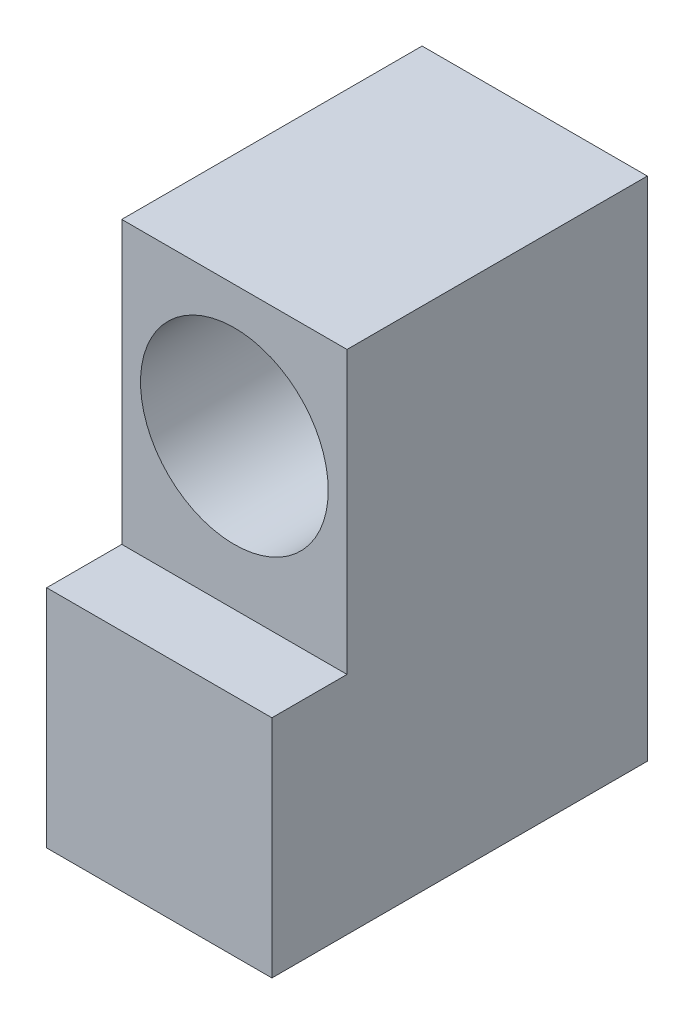
ISO-10303-21;
HEADER;
FILE_DESCRIPTION(('STEP AP214'),'2;1');
FILE_NAME('part.step','',(''),(''),'','','');
FILE_SCHEMA(('AUTOMOTIVE_DESIGN { 1 0 10303 214 1 1 1 1 }'));
ENDSEC;
DATA;
#1=APPLICATION_CONTEXT('core data for automotive mechanical design processes');
#2=APPLICATION_PROTOCOL_DEFINITION('international standard','automotive_design',2000,#1);
#3=PRODUCT_CONTEXT('',#1,'mechanical');
#4=PRODUCT('Part','Part','',(#3));
#5=PRODUCT_RELATED_PRODUCT_CATEGORY('part','',(#4));
#6=PRODUCT_DEFINITION_FORMATION('','',#4);
#7=PRODUCT_DEFINITION_CONTEXT('part definition',#1,'design');
#8=PRODUCT_DEFINITION('design','',#6,#7);
#9=PRODUCT_DEFINITION_SHAPE('','',#8);
#10=(LENGTH_UNIT() NAMED_UNIT(*) SI_UNIT(.MILLI.,.METRE.));
#11=(NAMED_UNIT(*) PLANE_ANGLE_UNIT() SI_UNIT($,.RADIAN.));
#12=(NAMED_UNIT(*) SI_UNIT($,.STERADIAN.) SOLID_ANGLE_UNIT());
#13=UNCERTAINTY_MEASURE_WITH_UNIT(LENGTH_MEASURE(1.E-05),#10,'distance_accuracy_value','');
#14=(GEOMETRIC_REPRESENTATION_CONTEXT(3) GLOBAL_UNCERTAINTY_ASSIGNED_CONTEXT((#13)) GLOBAL_UNIT_ASSIGNED_CONTEXT((#10,
#11,#12)) REPRESENTATION_CONTEXT('',''));
#15=CARTESIAN_POINT('',(0.,0.,0.));
#16=DIRECTION('',(0.,0.,1.));
#17=DIRECTION('',(1.,0.,0.));
#18=AXIS2_PLACEMENT_3D('',#15,#16,#17);
#19=CARTESIAN_POINT('',(0.500000000000002,0.,8.));
#20=DIRECTION('',(-1.,0.,0.));
#21=DIRECTION('',(0.,0.,1.));
#22=AXIS2_PLACEMENT_3D('',#19,#20,#21);
#23=PLANE('',#22);
#24=DIRECTION('',(0.,1.,0.));
#25=VECTOR('',#24,1.);
#26=CARTESIAN_POINT('',(0.500000000000002,0.,3.));
#27=LINE('',#26,#25);
#28=CARTESIAN_POINT('',(0.500000000000002,0.,3.));
#29=VERTEX_POINT('',#28);
#30=CARTESIAN_POINT('',(0.500000000000002,6.,3.));
#31=VERTEX_POINT('',#30);
#32=EDGE_CURVE('E129',#29,#31,#27,.T.);
#33=ORIENTED_EDGE('',*,*,#32,.F.);
#34=DIRECTION('',(0.,0.,-1.));
#35=VECTOR('',#34,1.);
#36=CARTESIAN_POINT('',(0.500000000000002,0.,8.));
#37=LINE('',#36,#35);
#38=CARTESIAN_POINT('',(0.500000000000002,0.,0.));
#39=VERTEX_POINT('',#38);
#40=EDGE_CURVE('E40',#29,#39,#37,.T.);
#41=ORIENTED_EDGE('',*,*,#40,.T.);
#42=DIRECTION('',(0.,1.,0.));
#43=VECTOR('',#42,1.);
#44=CARTESIAN_POINT('',(0.500000000000002,0.,0.));
#45=LINE('',#44,#43);
#46=CARTESIAN_POINT('',(0.500000000000002,6.,0.));
#47=VERTEX_POINT('',#46);
#48=EDGE_CURVE('E214',#39,#47,#45,.T.);
#49=ORIENTED_EDGE('',*,*,#48,.T.);
#50=DIRECTION('',(0.,0.,-1.));
#51=VECTOR('',#50,1.);
#52=CARTESIAN_POINT('',(0.500000000000002,6.,8.));
#53=LINE('',#52,#51);
#54=EDGE_CURVE('E157',#31,#47,#53,.T.);
#55=ORIENTED_EDGE('',*,*,#54,.F.);
#56=EDGE_LOOP('',(#33,#41,#49,#55));
#57=FACE_BOUND('',#56,.T.);
#58=ADVANCED_FACE('F30',(#57),#23,.F.);
#59=CARTESIAN_POINT('',(0.500000000000002,6.,8.));
#60=DIRECTION('',(0.,1.,0.));
#61=DIRECTION('',(0.,0.,1.));
#62=AXIS2_PLACEMENT_3D('',#59,#60,#61);
#63=PLANE('',#62);
#64=DIRECTION('',(1.,0.,0.));
#65=VECTOR('',#64,1.);
#66=CARTESIAN_POINT('',(5.5,6.,3.));
#67=LINE('',#66,#65);
#68=CARTESIAN_POINT('',(5.5,6.,3.));
#69=VERTEX_POINT('',#68);
#70=EDGE_CURVE('E131',#31,#69,#67,.T.);
#71=ORIENTED_EDGE('',*,*,#70,.F.);
#72=ORIENTED_EDGE('',*,*,#54,.T.);
#73=DIRECTION('',(1.,0.,0.));
#74=VECTOR('',#73,1.);
#75=CARTESIAN_POINT('',(0.500000000000002,6.,0.));
#76=LINE('',#75,#74);
#77=CARTESIAN_POINT('',(5.5,6.,0.));
#78=VERTEX_POINT('',#77);
#79=EDGE_CURVE('E204',#47,#78,#76,.T.);
#80=ORIENTED_EDGE('',*,*,#79,.T.);
#81=DIRECTION('',(0.,0.,-1.));
#82=VECTOR('',#81,1.);
#83=CARTESIAN_POINT('',(5.5,6.,8.));
#84=LINE('',#83,#82);
#85=EDGE_CURVE('E163',#69,#78,#84,.T.);
#86=ORIENTED_EDGE('',*,*,#85,.F.);
#87=EDGE_LOOP('',(#71,#72,#80,#86));
#88=FACE_BOUND('',#87,.T.);
#89=ADVANCED_FACE('F247',(#88),#63,.F.);
#90=CARTESIAN_POINT('',(5.5,6.,8.));
#91=DIRECTION('',(1.,0.,0.));
#92=DIRECTION('',(0.,0.,-1.));
#93=AXIS2_PLACEMENT_3D('',#90,#91,#92);
#94=PLANE('',#93);
#95=DIRECTION('',(0.,-1.,0.));
#96=VECTOR('',#95,1.);
#97=CARTESIAN_POINT('',(5.5,0.,3.));
#98=LINE('',#97,#96);
#99=CARTESIAN_POINT('',(5.5,0.,3.));
#100=VERTEX_POINT('',#99);
#101=EDGE_CURVE('E122',#69,#100,#98,.T.);
#102=ORIENTED_EDGE('',*,*,#101,.F.);
#103=ORIENTED_EDGE('',*,*,#85,.T.);
#104=DIRECTION('',(0.,-1.,0.));
#105=VECTOR('',#104,1.);
#106=CARTESIAN_POINT('',(5.5,6.,0.));
#107=LINE('',#106,#105);
#108=CARTESIAN_POINT('',(5.5,0.,0.));
#109=VERTEX_POINT('',#108);
#110=EDGE_CURVE('E199',#78,#109,#107,.T.);
#111=ORIENTED_EDGE('',*,*,#110,.T.);
#112=DIRECTION('',(0.,0.,-1.));
#113=VECTOR('',#112,1.);
#114=CARTESIAN_POINT('',(5.5,0.,8.));
#115=LINE('',#114,#113);
#116=EDGE_CURVE('E34',#100,#109,#115,.T.);
#117=ORIENTED_EDGE('',*,*,#116,.F.);
#118=EDGE_LOOP('',(#102,#103,#111,#117));
#119=FACE_BOUND('',#118,.T.);
#120=ADVANCED_FACE('F200',(#119),#94,.F.);
#121=CARTESIAN_POINT('',(0.,13.5,8.));
#122=DIRECTION('',(0.,0.,-1.));
#123=DIRECTION('',(-1.,0.,0.));
#124=AXIS2_PLACEMENT_3D('',#121,#122,#123);
#125=PLANE('',#124);
#126=CARTESIAN_POINT('',(3.,10.,8.));
#127=DIRECTION('',(0.,0.,1.));
#128=DIRECTION('',(1.,0.,0.));
#129=AXIS2_PLACEMENT_3D('',#126,#127,#128);
#130=CIRCLE('',#129,2.5);
#131=CARTESIAN_POINT('',(5.5,10.,8.));
#132=VERTEX_POINT('',#131);
#133=EDGE_CURVE('E221',#132,#132,#130,.T.);
#134=ORIENTED_EDGE('',*,*,#133,.F.);
#135=EDGE_LOOP('',(#134));
#136=FACE_BOUND('',#135,.T.);
#137=DIRECTION('',(-1.,0.,0.));
#138=VECTOR('',#137,1.);
#139=CARTESIAN_POINT('',(0.,6.00339366515839,8.));
#140=LINE('',#139,#138);
#141=CARTESIAN_POINT('',(5.99999999999999,6.00339366515839,8.));
#142=VERTEX_POINT('',#141);
#143=CARTESIAN_POINT('',(0.,6.00339366515839,8.));
#144=VERTEX_POINT('',#143);
#145=EDGE_CURVE('E48',#142,#144,#140,.T.);
#146=ORIENTED_EDGE('',*,*,#145,.F.);
#147=DIRECTION('',(0.,1.,0.));
#148=VECTOR('',#147,1.);
#149=CARTESIAN_POINT('',(6.,0.,8.));
#150=LINE('',#149,#148);
#151=CARTESIAN_POINT('',(5.99999999999999,13.5,8.));
#152=VERTEX_POINT('',#151);
#153=EDGE_CURVE('E140',#142,#152,#150,.T.);
#154=ORIENTED_EDGE('',*,*,#153,.T.);
#155=DIRECTION('',(-1.,0.,0.));
#156=VECTOR('',#155,1.);
#157=CARTESIAN_POINT('',(0.,13.5,8.));
#158=LINE('',#157,#156);
#159=CARTESIAN_POINT('',(0.,13.5,8.));
#160=VERTEX_POINT('',#159);
#161=EDGE_CURVE('E53',#152,#160,#158,.T.);
#162=ORIENTED_EDGE('',*,*,#161,.T.);
#163=DIRECTION('',(0.,-1.,0.));
#164=VECTOR('',#163,1.);
#165=CARTESIAN_POINT('',(0.,0.,8.));
#166=LINE('',#165,#164);
#167=EDGE_CURVE('E171',#160,#144,#166,.T.);
#168=ORIENTED_EDGE('',*,*,#167,.T.);
#169=EDGE_LOOP('',(#146,#154,#162,#168));
#170=FACE_BOUND('',#169,.T.);
#171=ADVANCED_FACE('F254',(#136,#170),#125,.F.);
#172=CARTESIAN_POINT('',(0.,13.5,0.));
#173=DIRECTION('',(0.,0.,-1.));
#174=DIRECTION('',(-1.,0.,0.));
#175=AXIS2_PLACEMENT_3D('',#172,#173,#174);
#176=PLANE('',#175);
#177=DIRECTION('',(0.,-1.,0.));
#178=VECTOR('',#177,1.);
#179=CARTESIAN_POINT('',(0.,0.,0.));
#180=LINE('',#179,#178);
#181=CARTESIAN_POINT('',(0.,13.5,0.));
#182=VERTEX_POINT('',#181);
#183=CARTESIAN_POINT('',(0.,0.,0.));
#184=VERTEX_POINT('',#183);
#185=EDGE_CURVE('E218',#182,#184,#180,.T.);
#186=ORIENTED_EDGE('',*,*,#185,.F.);
#187=DIRECTION('',(-1.,0.,0.));
#188=VECTOR('',#187,1.);
#189=CARTESIAN_POINT('',(0.,13.5,0.));
#190=LINE('',#189,#188);
#191=CARTESIAN_POINT('',(5.99999999999999,13.5,0.));
#192=VERTEX_POINT('',#191);
#193=EDGE_CURVE('E173',#192,#182,#190,.T.);
#194=ORIENTED_EDGE('',*,*,#193,.F.);
#195=DIRECTION('',(0.,1.,0.));
#196=VECTOR('',#195,1.);
#197=CARTESIAN_POINT('',(6.,0.,0.));
#198=LINE('',#197,#196);
#199=CARTESIAN_POINT('',(6.,0.,0.));
#200=VERTEX_POINT('',#199);
#201=EDGE_CURVE('E210',#200,#192,#198,.T.);
#202=ORIENTED_EDGE('',*,*,#201,.F.);
#203=DIRECTION('',(1.,0.,0.));
#204=VECTOR('',#203,1.);
#205=CARTESIAN_POINT('',(5.5,0.,0.));
#206=LINE('',#205,#204);
#207=EDGE_CURVE('E195',#109,#200,#206,.T.);
#208=ORIENTED_EDGE('',*,*,#207,.F.);
#209=ORIENTED_EDGE('',*,*,#110,.F.);
#210=ORIENTED_EDGE('',*,*,#79,.F.);
#211=ORIENTED_EDGE('',*,*,#48,.F.);
#212=DIRECTION('',(1.,0.,0.));
#213=VECTOR('',#212,1.);
#214=CARTESIAN_POINT('',(0.,0.,0.));
#215=LINE('',#214,#213);
#216=EDGE_CURVE('E216',#184,#39,#215,.T.);
#217=ORIENTED_EDGE('',*,*,#216,.F.);
#218=EDGE_LOOP('',(#186,#194,#202,#208,#209,#210,#211,#217));
#219=FACE_BOUND('',#218,.T.);
#220=CARTESIAN_POINT('',(3.,10.,0.));
#221=DIRECTION('',(0.,0.,1.));
#222=DIRECTION('',(1.,0.,0.));
#223=AXIS2_PLACEMENT_3D('',#220,#221,#222);
#224=CIRCLE('',#223,2.5);
#225=CARTESIAN_POINT('',(5.5,10.,0.));
#226=VERTEX_POINT('',#225);
#227=EDGE_CURVE('E152',#226,#226,#224,.T.);
#228=ORIENTED_EDGE('',*,*,#227,.T.);
#229=EDGE_LOOP('',(#228));
#230=FACE_BOUND('',#229,.T.);
#231=ADVANCED_FACE('F207',(#219,#230),#176,.T.);
#232=CARTESIAN_POINT('',(0.,0.,8.));
#233=DIRECTION('',(1.,0.,0.));
#234=DIRECTION('',(0.,1.,0.));
#235=AXIS2_PLACEMENT_3D('',#232,#233,#234);
#236=PLANE('',#235);
#237=ORIENTED_EDGE('',*,*,#185,.T.);
#238=DIRECTION('',(0.,0.,-1.));
#239=VECTOR('',#238,1.);
#240=CARTESIAN_POINT('',(0.,0.,8.));
#241=LINE('',#240,#239);
#242=CARTESIAN_POINT('',(0.,0.,10.));
#243=VERTEX_POINT('',#242);
#244=EDGE_CURVE('E11',#243,#184,#241,.T.);
#245=ORIENTED_EDGE('',*,*,#244,.F.);
#246=DIRECTION('',(0.,-1.,0.));
#247=VECTOR('',#246,1.);
#248=CARTESIAN_POINT('',(0.,0.,10.));
#249=LINE('',#248,#247);
#250=CARTESIAN_POINT('',(0.,6.00339366515839,10.));
#251=VERTEX_POINT('',#250);
#252=EDGE_CURVE('E147',#251,#243,#249,.T.);
#253=ORIENTED_EDGE('',*,*,#252,.F.);
#254=DIRECTION('',(0.,0.,-1.));
#255=VECTOR('',#254,1.);
#256=CARTESIAN_POINT('',(0.,6.00339366515839,10.));
#257=LINE('',#256,#255);
#258=EDGE_CURVE('E143',#251,#144,#257,.T.);
#259=ORIENTED_EDGE('',*,*,#258,.T.);
#260=ORIENTED_EDGE('',*,*,#167,.F.);
#261=DIRECTION('',(0.,0.,-1.));
#262=VECTOR('',#261,1.);
#263=CARTESIAN_POINT('',(0.,13.5,8.));
#264=LINE('',#263,#262);
#265=EDGE_CURVE('E180',#160,#182,#264,.T.);
#266=ORIENTED_EDGE('',*,*,#265,.T.);
#267=EDGE_LOOP('',(#237,#245,#253,#259,#260,#266));
#268=FACE_BOUND('',#267,.T.);
#269=ADVANCED_FACE('F32',(#268),#236,.F.);
#270=CARTESIAN_POINT('',(5.5,0.,8.));
#271=DIRECTION('',(0.,1.,0.));
#272=DIRECTION('',(0.,0.,1.));
#273=AXIS2_PLACEMENT_3D('',#270,#271,#272);
#274=PLANE('',#273);
#275=CARTESIAN_POINT('',(3.,0.,7.));
#276=DIRECTION('',(0.,-1.,0.));
#277=DIRECTION('',(0.,0.,-1.));
#278=AXIS2_PLACEMENT_3D('',#275,#276,#277);
#279=CIRCLE('',#278,0.79999999999999);
#280=CARTESIAN_POINT('',(3.,0.,6.20000000000001));
#281=VERTEX_POINT('',#280);
#282=EDGE_CURVE('E119',#281,#281,#279,.T.);
#283=ORIENTED_EDGE('',*,*,#282,.F.);
#284=EDGE_LOOP('',(#283));
#285=FACE_BOUND('',#284,.T.);
#286=DIRECTION('',(-1.,0.,0.));
#287=VECTOR('',#286,1.);
#288=CARTESIAN_POINT('',(5.5,0.,3.));
#289=LINE('',#288,#287);
#290=EDGE_CURVE('E127',#100,#29,#289,.T.);
#291=ORIENTED_EDGE('',*,*,#290,.F.);
#292=ORIENTED_EDGE('',*,*,#116,.T.);
#293=ORIENTED_EDGE('',*,*,#207,.T.);
#294=DIRECTION('',(0.,0.,-1.));
#295=VECTOR('',#294,1.);
#296=CARTESIAN_POINT('',(6.,0.,8.));
#297=LINE('',#296,#295);
#298=CARTESIAN_POINT('',(6.,0.,10.));
#299=VERTEX_POINT('',#298);
#300=EDGE_CURVE('E185',#299,#200,#297,.T.);
#301=ORIENTED_EDGE('',*,*,#300,.F.);
#302=DIRECTION('',(1.,0.,0.));
#303=VECTOR('',#302,1.);
#304=CARTESIAN_POINT('',(6.,0.,10.));
#305=LINE('',#304,#303);
#306=EDGE_CURVE('E135',#243,#299,#305,.T.);
#307=ORIENTED_EDGE('',*,*,#306,.F.);
#308=ORIENTED_EDGE('',*,*,#244,.T.);
#309=ORIENTED_EDGE('',*,*,#216,.T.);
#310=ORIENTED_EDGE('',*,*,#40,.F.);
#311=EDGE_LOOP('',(#291,#292,#293,#301,#307,#308,#309,#310));
#312=FACE_BOUND('',#311,.T.);
#313=ADVANCED_FACE('F193',(#285,#312),#274,.F.);
#314=CARTESIAN_POINT('',(6.,0.,8.));
#315=DIRECTION('',(-1.,0.,0.));
#316=DIRECTION('',(0.,-1.,0.));
#317=AXIS2_PLACEMENT_3D('',#314,#315,#316);
#318=PLANE('',#317);
#319=ORIENTED_EDGE('',*,*,#201,.T.);
#320=DIRECTION('',(0.,0.,-1.));
#321=VECTOR('',#320,1.);
#322=CARTESIAN_POINT('',(5.99999999999999,13.5,8.));
#323=LINE('',#322,#321);
#324=EDGE_CURVE('E183',#152,#192,#323,.T.);
#325=ORIENTED_EDGE('',*,*,#324,.F.);
#326=ORIENTED_EDGE('',*,*,#153,.F.);
#327=DIRECTION('',(0.,0.,-1.));
#328=VECTOR('',#327,1.);
#329=CARTESIAN_POINT('',(5.99999999999999,6.00339366515839,10.));
#330=LINE('',#329,#328);
#331=CARTESIAN_POINT('',(5.99999999999999,6.00339366515839,10.));
#332=VERTEX_POINT('',#331);
#333=EDGE_CURVE('E146',#332,#142,#330,.T.);
#334=ORIENTED_EDGE('',*,*,#333,.F.);
#335=DIRECTION('',(0.,1.,0.));
#336=VECTOR('',#335,1.);
#337=CARTESIAN_POINT('',(5.99999999999999,6.00339366515839,10.));
#338=LINE('',#337,#336);
#339=EDGE_CURVE('E229',#299,#332,#338,.T.);
#340=ORIENTED_EDGE('',*,*,#339,.F.);
#341=ORIENTED_EDGE('',*,*,#300,.T.);
#342=EDGE_LOOP('',(#319,#325,#326,#334,#340,#341));
#343=FACE_BOUND('',#342,.T.);
#344=ADVANCED_FACE('F236',(#343),#318,.F.);
#345=CARTESIAN_POINT('',(0.,13.5,8.));
#346=DIRECTION('',(0.,-1.,0.));
#347=DIRECTION('',(0.,0.,-1.));
#348=AXIS2_PLACEMENT_3D('',#345,#346,#347);
#349=PLANE('',#348);
#350=ORIENTED_EDGE('',*,*,#193,.T.);
#351=ORIENTED_EDGE('',*,*,#265,.F.);
#352=ORIENTED_EDGE('',*,*,#161,.F.);
#353=ORIENTED_EDGE('',*,*,#324,.T.);
#354=EDGE_LOOP('',(#350,#351,#352,#353));
#355=FACE_BOUND('',#354,.T.);
#356=ADVANCED_FACE('F262',(#355),#349,.F.);
#357=CARTESIAN_POINT('',(3.,10.,8.));
#358=DIRECTION('',(0.,0.,-1.));
#359=DIRECTION('',(-1.,0.,0.));
#360=AXIS2_PLACEMENT_3D('',#357,#358,#359);
#361=CYLINDRICAL_SURFACE('',#360,2.5);
#362=ORIENTED_EDGE('',*,*,#133,.T.);
#363=EDGE_LOOP('',(#362));
#364=FACE_BOUND('',#363,.T.);
#365=ORIENTED_EDGE('',*,*,#227,.F.);
#366=EDGE_LOOP('',(#365));
#367=FACE_BOUND('',#366,.T.);
#368=ADVANCED_FACE('F265',(#364,#367),#361,.F.);
#369=CARTESIAN_POINT('',(0.,6.00339366515839,10.));
#370=DIRECTION('',(0.,-1.,0.));
#371=DIRECTION('',(0.,0.,-1.));
#372=AXIS2_PLACEMENT_3D('',#369,#370,#371);
#373=PLANE('',#372);
#374=ORIENTED_EDGE('',*,*,#145,.T.);
#375=ORIENTED_EDGE('',*,*,#258,.F.);
#376=DIRECTION('',(-1.,0.,0.));
#377=VECTOR('',#376,1.);
#378=CARTESIAN_POINT('',(0.,6.00339366515839,10.));
#379=LINE('',#378,#377);
#380=EDGE_CURVE('E228',#332,#251,#379,.T.);
#381=ORIENTED_EDGE('',*,*,#380,.F.);
#382=ORIENTED_EDGE('',*,*,#333,.T.);
#383=EDGE_LOOP('',(#374,#375,#381,#382));
#384=FACE_BOUND('',#383,.T.);
#385=ADVANCED_FACE('F241',(#384),#373,.F.);
#386=CARTESIAN_POINT('',(0.,0.,10.));
#387=DIRECTION('',(0.,0.,-1.));
#388=DIRECTION('',(-1.,0.,0.));
#389=AXIS2_PLACEMENT_3D('',#386,#387,#388);
#390=PLANE('',#389);
#391=ORIENTED_EDGE('',*,*,#306,.T.);
#392=ORIENTED_EDGE('',*,*,#339,.T.);
#393=ORIENTED_EDGE('',*,*,#380,.T.);
#394=ORIENTED_EDGE('',*,*,#252,.T.);
#395=EDGE_LOOP('',(#391,#392,#393,#394));
#396=FACE_BOUND('',#395,.T.);
#397=ADVANCED_FACE('F234',(#396),#390,.F.);
#398=CARTESIAN_POINT('',(5.5,6.,3.));
#399=DIRECTION('',(0.,0.,1.));
#400=DIRECTION('',(1.,0.,0.));
#401=AXIS2_PLACEMENT_3D('',#398,#399,#400);
#402=PLANE('',#401);
#403=ORIENTED_EDGE('',*,*,#101,.T.);
#404=ORIENTED_EDGE('',*,*,#290,.T.);
#405=ORIENTED_EDGE('',*,*,#32,.T.);
#406=ORIENTED_EDGE('',*,*,#70,.T.);
#407=EDGE_LOOP('',(#403,#404,#405,#406));
#408=FACE_BOUND('',#407,.T.);
#409=ADVANCED_FACE('F246',(#408),#402,.F.);
#410=CARTESIAN_POINT('',(3.,0.,7.));
#411=DIRECTION('',(0.,-1.,0.));
#412=DIRECTION('',(0.,0.,-1.));
#413=AXIS2_PLACEMENT_3D('',#410,#411,#412);
#414=CYLINDRICAL_SURFACE('',#413,0.799999999999994);
#415=CARTESIAN_POINT('',(3.,5.,7.));
#416=DIRECTION('',(0.,-1.,0.));
#417=DIRECTION('',(0.,0.,-1.));
#418=AXIS2_PLACEMENT_3D('',#415,#416,#417);
#419=CIRCLE('',#418,0.799999999999998);
#420=CARTESIAN_POINT('',(3.,5.,6.2));
#421=VERTEX_POINT('',#420);
#422=EDGE_CURVE('E117',#421,#421,#419,.T.);
#423=ORIENTED_EDGE('',*,*,#422,.F.);
#424=EDGE_LOOP('',(#423));
#425=FACE_BOUND('',#424,.T.);
#426=ORIENTED_EDGE('',*,*,#282,.T.);
#427=EDGE_LOOP('',(#426));
#428=FACE_BOUND('',#427,.T.);
#429=ADVANCED_FACE('F113',(#425,#428),#414,.F.);
#430=CARTESIAN_POINT('',(3.,5.,7.));
#431=DIRECTION('',(0.,-1.,0.));
#432=DIRECTION('',(0.,0.,-1.));
#433=AXIS2_PLACEMENT_3D('',#430,#431,#432);
#434=CONICAL_SURFACE('',#433,0.799999999999998,1.02974425867665);
#435=CARTESIAN_POINT('',(3.,5.48068849522205,7.));
#436=VERTEX_POINT('',#435);
#437=VERTEX_LOOP('',#436);
#438=FACE_BOUND('',#437,.T.);
#439=ORIENTED_EDGE('',*,*,#422,.T.);
#440=EDGE_LOOP('',(#439));
#441=FACE_BOUND('',#440,.T.);
#442=ADVANCED_FACE('F110',(#438,#441),#434,.F.);
#443=CLOSED_SHELL('',(#58,#89,#120,#171,#231,#269,#313,#344,#356,#368,#385,#397,#409,#429,#442));
#444=MANIFOLD_SOLID_BREP('B2',#443);
#445=ADVANCED_BREP_SHAPE_REPRESENTATION('',(#18,#444),#14);
#446=SHAPE_DEFINITION_REPRESENTATION(#9,#445);
ENDSEC;
END-ISO-10303-21;
